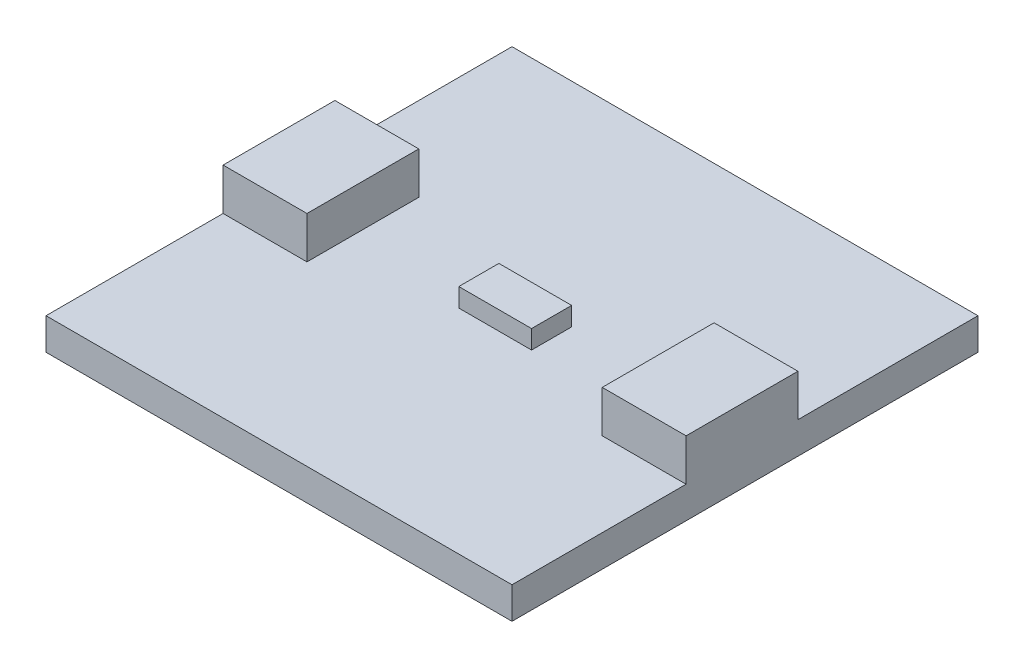
ISO-10303-21;
HEADER;
FILE_DESCRIPTION(('STEP AP214'),'2;1');
FILE_NAME('part.step','',(''),(''),'','','');
FILE_SCHEMA(('AUTOMOTIVE_DESIGN { 1 0 10303 214 1 1 1 1 }'));
ENDSEC;
DATA;
#1=APPLICATION_CONTEXT('core data for automotive mechanical design processes');
#2=APPLICATION_PROTOCOL_DEFINITION('international standard','automotive_design',2000,#1);
#3=PRODUCT_CONTEXT('',#1,'mechanical');
#4=PRODUCT('Part','Part','',(#3));
#5=PRODUCT_RELATED_PRODUCT_CATEGORY('part','',(#4));
#6=PRODUCT_DEFINITION_FORMATION('','',#4);
#7=PRODUCT_DEFINITION_CONTEXT('part definition',#1,'design');
#8=PRODUCT_DEFINITION('design','',#6,#7);
#9=PRODUCT_DEFINITION_SHAPE('','',#8);
#10=(LENGTH_UNIT() NAMED_UNIT(*) SI_UNIT(.MILLI.,.METRE.));
#11=(NAMED_UNIT(*) PLANE_ANGLE_UNIT() SI_UNIT($,.RADIAN.));
#12=(NAMED_UNIT(*) SI_UNIT($,.STERADIAN.) SOLID_ANGLE_UNIT());
#13=UNCERTAINTY_MEASURE_WITH_UNIT(LENGTH_MEASURE(1.E-05),#10,'distance_accuracy_value','');
#14=(GEOMETRIC_REPRESENTATION_CONTEXT(3) GLOBAL_UNCERTAINTY_ASSIGNED_CONTEXT((#13)) GLOBAL_UNIT_ASSIGNED_CONTEXT((#10,
#11,#12)) REPRESENTATION_CONTEXT('',''));
#15=CARTESIAN_POINT('',(0.,0.,0.));
#16=DIRECTION('',(0.,0.,1.));
#17=DIRECTION('',(1.,0.,0.));
#18=AXIS2_PLACEMENT_3D('',#15,#16,#17);
#19=CARTESIAN_POINT('',(0.,1.7272,0.));
#20=DIRECTION('',(0.,1.,0.));
#21=DIRECTION('',(0.,0.,1.));
#22=AXIS2_PLACEMENT_3D('',#19,#20,#21);
#23=PLANE('',#22);
#24=DIRECTION('',(0.,0.,-1.));
#25=VECTOR('',#24,1.);
#26=CARTESIAN_POINT('',(25.4,1.7272,0.));
#27=LINE('',#26,#25);
#28=CARTESIAN_POINT('',(25.4,1.7272,25.4));
#29=VERTEX_POINT('',#28);
#30=CARTESIAN_POINT('',(25.4,1.7272,15.9105415553491));
#31=VERTEX_POINT('',#30);
#32=EDGE_CURVE('E239',#29,#31,#27,.T.);
#33=ORIENTED_EDGE('',*,*,#32,.T.);
#34=DIRECTION('',(1.,0.,0.));
#35=VECTOR('',#34,1.);
#36=CARTESIAN_POINT('',(20.828,1.7272,15.9105415553491));
#37=LINE('',#36,#35);
#38=CARTESIAN_POINT('',(20.828,1.7272,15.9105415553491));
#39=VERTEX_POINT('',#38);
#40=EDGE_CURVE('E176',#39,#31,#37,.T.);
#41=ORIENTED_EDGE('',*,*,#40,.F.);
#42=DIRECTION('',(0.,0.,1.));
#43=VECTOR('',#42,1.);
#44=CARTESIAN_POINT('',(20.828,1.7272,9.81454155534912));
#45=LINE('',#44,#43);
#46=CARTESIAN_POINT('',(20.828,1.7272,9.81454155534912));
#47=VERTEX_POINT('',#46);
#48=EDGE_CURVE('E173',#47,#39,#45,.T.);
#49=ORIENTED_EDGE('',*,*,#48,.F.);
#50=DIRECTION('',(-1.,0.,0.));
#51=VECTOR('',#50,1.);
#52=CARTESIAN_POINT('',(20.828,1.7272,9.81454155534912));
#53=LINE('',#52,#51);
#54=CARTESIAN_POINT('',(25.4,1.7272,9.81454155534912));
#55=VERTEX_POINT('',#54);
#56=EDGE_CURVE('E185',#55,#47,#53,.T.);
#57=ORIENTED_EDGE('',*,*,#56,.F.);
#58=CARTESIAN_POINT('',(25.4,1.7272,0.));
#59=VERTEX_POINT('',#58);
#60=EDGE_CURVE('E238',#55,#59,#27,.T.);
#61=ORIENTED_EDGE('',*,*,#60,.T.);
#62=DIRECTION('',(-1.,0.,0.));
#63=VECTOR('',#62,1.);
#64=CARTESIAN_POINT('',(0.,1.7272,0.));
#65=LINE('',#64,#63);
#66=CARTESIAN_POINT('',(0.,1.7272,0.));
#67=VERTEX_POINT('',#66);
#68=EDGE_CURVE('E242',#59,#67,#65,.T.);
#69=ORIENTED_EDGE('',*,*,#68,.T.);
#70=DIRECTION('',(0.,0.,1.));
#71=VECTOR('',#70,1.);
#72=CARTESIAN_POINT('',(0.,1.7272,0.));
#73=LINE('',#72,#71);
#74=CARTESIAN_POINT('',(0.,1.7272,9.652));
#75=VERTEX_POINT('',#74);
#76=EDGE_CURVE('E233',#67,#75,#73,.T.);
#77=ORIENTED_EDGE('',*,*,#76,.T.);
#78=DIRECTION('',(-1.,0.,0.));
#79=VECTOR('',#78,1.);
#80=CARTESIAN_POINT('',(0.,1.7272,9.652));
#81=LINE('',#80,#79);
#82=CARTESIAN_POINT('',(4.572,1.7272,9.652));
#83=VERTEX_POINT('',#82);
#84=EDGE_CURVE('E207',#83,#75,#81,.T.);
#85=ORIENTED_EDGE('',*,*,#84,.F.);
#86=DIRECTION('',(0.,0.,-1.));
#87=VECTOR('',#86,1.);
#88=CARTESIAN_POINT('',(4.572,1.7272,9.652));
#89=LINE('',#88,#87);
#90=CARTESIAN_POINT('',(4.572,1.7272,15.748));
#91=VERTEX_POINT('',#90);
#92=EDGE_CURVE('E216',#91,#83,#89,.T.);
#93=ORIENTED_EDGE('',*,*,#92,.F.);
#94=DIRECTION('',(1.,0.,0.));
#95=VECTOR('',#94,1.);
#96=CARTESIAN_POINT('',(0.,1.7272,15.748));
#97=LINE('',#96,#95);
#98=CARTESIAN_POINT('',(0.,1.7272,15.748));
#99=VERTEX_POINT('',#98);
#100=EDGE_CURVE('E202',#99,#91,#97,.T.);
#101=ORIENTED_EDGE('',*,*,#100,.F.);
#102=CARTESIAN_POINT('',(0.,1.7272,25.4));
#103=VERTEX_POINT('',#102);
#104=EDGE_CURVE('E236',#99,#103,#73,.T.);
#105=ORIENTED_EDGE('',*,*,#104,.T.);
#106=DIRECTION('',(1.,0.,0.));
#107=VECTOR('',#106,1.);
#108=CARTESIAN_POINT('',(0.,1.7272,25.4));
#109=LINE('',#108,#107);
#110=EDGE_CURVE('E235',#103,#29,#109,.T.);
#111=ORIENTED_EDGE('',*,*,#110,.T.);
#112=EDGE_LOOP('',(#33,#41,#49,#57,#61,#69,#77,#85,#93,#101,#105,#111));
#113=FACE_BOUND('',#112,.T.);
#114=DIRECTION('',(1.,0.,0.));
#115=VECTOR('',#114,1.);
#116=CARTESIAN_POINT('',(10.8889001680961,1.7272,13.7885522781072));
#117=LINE('',#116,#115);
#118=CARTESIAN_POINT('',(10.8889001680961,1.7272,13.7885522781072));
#119=VERTEX_POINT('',#118);
#120=CARTESIAN_POINT('',(14.8545502203135,1.7272,13.7885522781072));
#121=VERTEX_POINT('',#120);
#122=EDGE_CURVE('E476',#119,#121,#117,.T.);
#123=ORIENTED_EDGE('',*,*,#122,.F.);
#124=DIRECTION('',(0.,0.,1.));
#125=VECTOR('',#124,1.);
#126=CARTESIAN_POINT('',(10.8889001680961,1.7272,11.6037503074584));
#127=LINE('',#126,#125);
#128=CARTESIAN_POINT('',(10.8889001680961,1.7272,11.6037503074584));
#129=VERTEX_POINT('',#128);
#130=EDGE_CURVE('E171',#129,#119,#127,.T.);
#131=ORIENTED_EDGE('',*,*,#130,.F.);
#132=DIRECTION('',(-1.,0.,0.));
#133=VECTOR('',#132,1.);
#134=CARTESIAN_POINT('',(10.8889001680961,1.7272,11.6037503074584));
#135=LINE('',#134,#133);
#136=CARTESIAN_POINT('',(14.8545502203135,1.7272,11.6037503074584));
#137=VERTEX_POINT('',#136);
#138=EDGE_CURVE('E167',#137,#129,#135,.T.);
#139=ORIENTED_EDGE('',*,*,#138,.F.);
#140=DIRECTION('',(0.,0.,-1.));
#141=VECTOR('',#140,1.);
#142=CARTESIAN_POINT('',(14.8545502203135,1.7272,11.6037503074584));
#143=LINE('',#142,#141);
#144=EDGE_CURVE('E473',#121,#137,#143,.T.);
#145=ORIENTED_EDGE('',*,*,#144,.F.);
#146=EDGE_LOOP('',(#123,#131,#139,#145));
#147=FACE_BOUND('',#146,.T.);
#148=ADVANCED_FACE('F34',(#113,#147),#23,.T.);
#149=CARTESIAN_POINT('',(0.,1.7272,0.));
#150=DIRECTION('',(1.,0.,0.));
#151=DIRECTION('',(0.,0.,-1.));
#152=AXIS2_PLACEMENT_3D('',#149,#150,#151);
#153=PLANE('',#152);
#154=DIRECTION('',(0.,0.,1.));
#155=VECTOR('',#154,1.);
#156=CARTESIAN_POINT('',(0.,0.,0.));
#157=LINE('',#156,#155);
#158=CARTESIAN_POINT('',(0.,0.,0.));
#159=VERTEX_POINT('',#158);
#160=CARTESIAN_POINT('',(0.,0.,25.4));
#161=VERTEX_POINT('',#160);
#162=EDGE_CURVE('E232',#159,#161,#157,.T.);
#163=ORIENTED_EDGE('',*,*,#162,.T.);
#164=DIRECTION('',(0.,-1.,0.));
#165=VECTOR('',#164,1.);
#166=CARTESIAN_POINT('',(0.,1.7272,25.4));
#167=LINE('',#166,#165);
#168=EDGE_CURVE('E11',#103,#161,#167,.T.);
#169=ORIENTED_EDGE('',*,*,#168,.F.);
#170=ORIENTED_EDGE('',*,*,#104,.F.);
#171=DIRECTION('',(0.,-1.,0.));
#172=VECTOR('',#171,1.);
#173=CARTESIAN_POINT('',(0.,4.0132,15.748));
#174=LINE('',#173,#172);
#175=CARTESIAN_POINT('',(0.,4.0132,15.748));
#176=VERTEX_POINT('',#175);
#177=EDGE_CURVE('E229',#176,#99,#174,.T.);
#178=ORIENTED_EDGE('',*,*,#177,.F.);
#179=DIRECTION('',(0.,0.,1.));
#180=VECTOR('',#179,1.);
#181=CARTESIAN_POINT('',(0.,4.0132,9.652));
#182=LINE('',#181,#180);
#183=CARTESIAN_POINT('',(0.,4.0132,9.652));
#184=VERTEX_POINT('',#183);
#185=EDGE_CURVE('E203',#184,#176,#182,.T.);
#186=ORIENTED_EDGE('',*,*,#185,.F.);
#187=DIRECTION('',(0.,-1.,0.));
#188=VECTOR('',#187,1.);
#189=CARTESIAN_POINT('',(0.,4.0132,9.652));
#190=LINE('',#189,#188);
#191=EDGE_CURVE('E213',#184,#75,#190,.T.);
#192=ORIENTED_EDGE('',*,*,#191,.T.);
#193=ORIENTED_EDGE('',*,*,#76,.F.);
#194=DIRECTION('',(0.,-1.,0.));
#195=VECTOR('',#194,1.);
#196=CARTESIAN_POINT('',(0.,1.7272,0.));
#197=LINE('',#196,#195);
#198=EDGE_CURVE('E244',#67,#159,#197,.T.);
#199=ORIENTED_EDGE('',*,*,#198,.T.);
#200=EDGE_LOOP('',(#163,#169,#170,#178,#186,#192,#193,#199));
#201=FACE_BOUND('',#200,.T.);
#202=ADVANCED_FACE('F36',(#201),#153,.F.);
#203=CARTESIAN_POINT('',(0.,1.7272,25.4));
#204=DIRECTION('',(0.,0.,-1.));
#205=DIRECTION('',(-1.,0.,0.));
#206=AXIS2_PLACEMENT_3D('',#203,#204,#205);
#207=PLANE('',#206);
#208=DIRECTION('',(1.,0.,0.));
#209=VECTOR('',#208,1.);
#210=CARTESIAN_POINT('',(0.,0.,25.4));
#211=LINE('',#210,#209);
#212=CARTESIAN_POINT('',(25.4,0.,25.4));
#213=VERTEX_POINT('',#212);
#214=EDGE_CURVE('E247',#161,#213,#211,.T.);
#215=ORIENTED_EDGE('',*,*,#214,.T.);
#216=DIRECTION('',(0.,-1.,0.));
#217=VECTOR('',#216,1.);
#218=CARTESIAN_POINT('',(25.4,1.7272,25.4));
#219=LINE('',#218,#217);
#220=EDGE_CURVE('E42',#29,#213,#219,.T.);
#221=ORIENTED_EDGE('',*,*,#220,.F.);
#222=ORIENTED_EDGE('',*,*,#110,.F.);
#223=ORIENTED_EDGE('',*,*,#168,.T.);
#224=EDGE_LOOP('',(#215,#221,#222,#223));
#225=FACE_BOUND('',#224,.T.);
#226=ADVANCED_FACE('F293',(#225),#207,.F.);
#227=CARTESIAN_POINT('',(25.4,1.7272,0.));
#228=DIRECTION('',(-1.,0.,0.));
#229=DIRECTION('',(0.,0.,1.));
#230=AXIS2_PLACEMENT_3D('',#227,#228,#229);
#231=PLANE('',#230);
#232=DIRECTION('',(0.,0.,-1.));
#233=VECTOR('',#232,1.);
#234=CARTESIAN_POINT('',(25.4,0.,0.));
#235=LINE('',#234,#233);
#236=CARTESIAN_POINT('',(25.4,0.,0.));
#237=VERTEX_POINT('',#236);
#238=EDGE_CURVE('E249',#213,#237,#235,.T.);
#239=ORIENTED_EDGE('',*,*,#238,.T.);
#240=DIRECTION('',(0.,-1.,0.));
#241=VECTOR('',#240,1.);
#242=CARTESIAN_POINT('',(25.4,1.7272,0.));
#243=LINE('',#242,#241);
#244=EDGE_CURVE('E255',#59,#237,#243,.T.);
#245=ORIENTED_EDGE('',*,*,#244,.F.);
#246=ORIENTED_EDGE('',*,*,#60,.F.);
#247=DIRECTION('',(0.,-1.,0.));
#248=VECTOR('',#247,1.);
#249=CARTESIAN_POINT('',(25.4,4.0132,9.81454155534912));
#250=LINE('',#249,#248);
#251=CARTESIAN_POINT('',(25.4,4.0132,9.81454155534912));
#252=VERTEX_POINT('',#251);
#253=EDGE_CURVE('E57',#252,#55,#250,.T.);
#254=ORIENTED_EDGE('',*,*,#253,.F.);
#255=DIRECTION('',(0.,0.,-1.));
#256=VECTOR('',#255,1.);
#257=CARTESIAN_POINT('',(25.4,4.0132,9.81454155534912));
#258=LINE('',#257,#256);
#259=CARTESIAN_POINT('',(25.4,4.0132,15.9105415553491));
#260=VERTEX_POINT('',#259);
#261=EDGE_CURVE('E187',#260,#252,#258,.T.);
#262=ORIENTED_EDGE('',*,*,#261,.F.);
#263=DIRECTION('',(0.,-1.,0.));
#264=VECTOR('',#263,1.);
#265=CARTESIAN_POINT('',(25.4,4.0132,15.9105415553491));
#266=LINE('',#265,#264);
#267=EDGE_CURVE('E197',#260,#31,#266,.T.);
#268=ORIENTED_EDGE('',*,*,#267,.T.);
#269=ORIENTED_EDGE('',*,*,#32,.F.);
#270=ORIENTED_EDGE('',*,*,#220,.T.);
#271=EDGE_LOOP('',(#239,#245,#246,#254,#262,#268,#269,#270));
#272=FACE_BOUND('',#271,.T.);
#273=ADVANCED_FACE('F262',(#272),#231,.F.);
#274=CARTESIAN_POINT('',(0.,1.7272,0.));
#275=DIRECTION('',(0.,0.,1.));
#276=DIRECTION('',(1.,0.,0.));
#277=AXIS2_PLACEMENT_3D('',#274,#275,#276);
#278=PLANE('',#277);
#279=DIRECTION('',(-1.,0.,0.));
#280=VECTOR('',#279,1.);
#281=CARTESIAN_POINT('',(0.,0.,0.));
#282=LINE('',#281,#280);
#283=EDGE_CURVE('E251',#237,#159,#282,.T.);
#284=ORIENTED_EDGE('',*,*,#283,.T.);
#285=ORIENTED_EDGE('',*,*,#198,.F.);
#286=ORIENTED_EDGE('',*,*,#68,.F.);
#287=ORIENTED_EDGE('',*,*,#244,.T.);
#288=EDGE_LOOP('',(#284,#285,#286,#287));
#289=FACE_BOUND('',#288,.T.);
#290=ADVANCED_FACE('F272',(#289),#278,.F.);
#291=CARTESIAN_POINT('',(0.,0.,0.));
#292=DIRECTION('',(0.,1.,0.));
#293=DIRECTION('',(0.,0.,1.));
#294=AXIS2_PLACEMENT_3D('',#291,#292,#293);
#295=PLANE('',#294);
#296=ORIENTED_EDGE('',*,*,#162,.F.);
#297=ORIENTED_EDGE('',*,*,#283,.F.);
#298=ORIENTED_EDGE('',*,*,#238,.F.);
#299=ORIENTED_EDGE('',*,*,#214,.F.);
#300=EDGE_LOOP('',(#296,#297,#298,#299));
#301=FACE_BOUND('',#300,.T.);
#302=ADVANCED_FACE('F269',(#301),#295,.F.);
#303=CARTESIAN_POINT('',(0.,4.0132,15.748));
#304=DIRECTION('',(0.,0.,-1.));
#305=DIRECTION('',(-1.,0.,0.));
#306=AXIS2_PLACEMENT_3D('',#303,#304,#305);
#307=PLANE('',#306);
#308=ORIENTED_EDGE('',*,*,#100,.T.);
#309=DIRECTION('',(0.,-1.,0.));
#310=VECTOR('',#309,1.);
#311=CARTESIAN_POINT('',(4.572,4.0132,15.748));
#312=LINE('',#311,#310);
#313=CARTESIAN_POINT('',(4.572,4.0132,15.748));
#314=VERTEX_POINT('',#313);
#315=EDGE_CURVE('E226',#314,#91,#312,.T.);
#316=ORIENTED_EDGE('',*,*,#315,.F.);
#317=DIRECTION('',(1.,0.,0.));
#318=VECTOR('',#317,1.);
#319=CARTESIAN_POINT('',(0.,4.0132,15.748));
#320=LINE('',#319,#318);
#321=EDGE_CURVE('E206',#176,#314,#320,.T.);
#322=ORIENTED_EDGE('',*,*,#321,.F.);
#323=ORIENTED_EDGE('',*,*,#177,.T.);
#324=EDGE_LOOP('',(#308,#316,#322,#323));
#325=FACE_BOUND('',#324,.T.);
#326=ADVANCED_FACE('F291',(#325),#307,.F.);
#327=CARTESIAN_POINT('',(4.572,4.0132,9.652));
#328=DIRECTION('',(-1.,0.,0.));
#329=DIRECTION('',(0.,0.,1.));
#330=AXIS2_PLACEMENT_3D('',#327,#328,#329);
#331=PLANE('',#330);
#332=ORIENTED_EDGE('',*,*,#92,.T.);
#333=DIRECTION('',(0.,-1.,0.));
#334=VECTOR('',#333,1.);
#335=CARTESIAN_POINT('',(4.572,4.0132,9.652));
#336=LINE('',#335,#334);
#337=CARTESIAN_POINT('',(4.572,4.0132,9.652));
#338=VERTEX_POINT('',#337);
#339=EDGE_CURVE('E223',#338,#83,#336,.T.);
#340=ORIENTED_EDGE('',*,*,#339,.F.);
#341=DIRECTION('',(0.,0.,-1.));
#342=VECTOR('',#341,1.);
#343=CARTESIAN_POINT('',(4.572,4.0132,9.652));
#344=LINE('',#343,#342);
#345=EDGE_CURVE('E209',#314,#338,#344,.T.);
#346=ORIENTED_EDGE('',*,*,#345,.F.);
#347=ORIENTED_EDGE('',*,*,#315,.T.);
#348=EDGE_LOOP('',(#332,#340,#346,#347));
#349=FACE_BOUND('',#348,.T.);
#350=ADVANCED_FACE('F287',(#349),#331,.F.);
#351=CARTESIAN_POINT('',(0.,4.0132,9.652));
#352=DIRECTION('',(0.,0.,1.));
#353=DIRECTION('',(1.,0.,0.));
#354=AXIS2_PLACEMENT_3D('',#351,#352,#353);
#355=PLANE('',#354);
#356=ORIENTED_EDGE('',*,*,#84,.T.);
#357=ORIENTED_EDGE('',*,*,#191,.F.);
#358=DIRECTION('',(-1.,0.,0.));
#359=VECTOR('',#358,1.);
#360=CARTESIAN_POINT('',(0.,4.0132,9.652));
#361=LINE('',#360,#359);
#362=EDGE_CURVE('E211',#338,#184,#361,.T.);
#363=ORIENTED_EDGE('',*,*,#362,.F.);
#364=ORIENTED_EDGE('',*,*,#339,.T.);
#365=EDGE_LOOP('',(#356,#357,#363,#364));
#366=FACE_BOUND('',#365,.T.);
#367=ADVANCED_FACE('F282',(#366),#355,.F.);
#368=CARTESIAN_POINT('',(0.,4.0132,0.));
#369=DIRECTION('',(0.,1.,0.));
#370=DIRECTION('',(0.,0.,1.));
#371=AXIS2_PLACEMENT_3D('',#368,#369,#370);
#372=PLANE('',#371);
#373=ORIENTED_EDGE('',*,*,#185,.T.);
#374=ORIENTED_EDGE('',*,*,#321,.T.);
#375=ORIENTED_EDGE('',*,*,#345,.T.);
#376=ORIENTED_EDGE('',*,*,#362,.T.);
#377=EDGE_LOOP('',(#373,#374,#375,#376));
#378=FACE_BOUND('',#377,.T.);
#379=ADVANCED_FACE('F338',(#378),#372,.T.);
#380=CARTESIAN_POINT('',(20.828,4.0132,9.81454155534912));
#381=DIRECTION('',(1.,0.,0.));
#382=DIRECTION('',(0.,0.,-1.));
#383=AXIS2_PLACEMENT_3D('',#380,#381,#382);
#384=PLANE('',#383);
#385=ORIENTED_EDGE('',*,*,#48,.T.);
#386=DIRECTION('',(0.,-1.,0.));
#387=VECTOR('',#386,1.);
#388=CARTESIAN_POINT('',(20.828,4.0132,15.9105415553491));
#389=LINE('',#388,#387);
#390=CARTESIAN_POINT('',(20.828,4.0132,15.9105415553491));
#391=VERTEX_POINT('',#390);
#392=EDGE_CURVE('E200',#391,#39,#389,.T.);
#393=ORIENTED_EDGE('',*,*,#392,.F.);
#394=DIRECTION('',(0.,0.,1.));
#395=VECTOR('',#394,1.);
#396=CARTESIAN_POINT('',(20.828,4.0132,9.81454155534912));
#397=LINE('',#396,#395);
#398=CARTESIAN_POINT('',(20.828,4.0132,9.81454155534912));
#399=VERTEX_POINT('',#398);
#400=EDGE_CURVE('E181',#399,#391,#397,.T.);
#401=ORIENTED_EDGE('',*,*,#400,.F.);
#402=DIRECTION('',(0.,-1.,0.));
#403=VECTOR('',#402,1.);
#404=CARTESIAN_POINT('',(20.828,4.0132,9.81454155534912));
#405=LINE('',#404,#403);
#406=EDGE_CURVE('E190',#399,#47,#405,.T.);
#407=ORIENTED_EDGE('',*,*,#406,.T.);
#408=EDGE_LOOP('',(#385,#393,#401,#407));
#409=FACE_BOUND('',#408,.T.);
#410=ADVANCED_FACE('F346',(#409),#384,.F.);
#411=CARTESIAN_POINT('',(20.828,4.0132,15.9105415553491));
#412=DIRECTION('',(0.,0.,-1.));
#413=DIRECTION('',(-1.,0.,0.));
#414=AXIS2_PLACEMENT_3D('',#411,#412,#413);
#415=PLANE('',#414);
#416=ORIENTED_EDGE('',*,*,#40,.T.);
#417=ORIENTED_EDGE('',*,*,#267,.F.);
#418=DIRECTION('',(1.,0.,0.));
#419=VECTOR('',#418,1.);
#420=CARTESIAN_POINT('',(20.828,4.0132,15.9105415553491));
#421=LINE('',#420,#419);
#422=EDGE_CURVE('E184',#391,#260,#421,.T.);
#423=ORIENTED_EDGE('',*,*,#422,.F.);
#424=ORIENTED_EDGE('',*,*,#392,.T.);
#425=EDGE_LOOP('',(#416,#417,#423,#424));
#426=FACE_BOUND('',#425,.T.);
#427=ADVANCED_FACE('F353',(#426),#415,.F.);
#428=CARTESIAN_POINT('',(20.828,4.0132,9.81454155534912));
#429=DIRECTION('',(0.,0.,1.));
#430=DIRECTION('',(1.,0.,0.));
#431=AXIS2_PLACEMENT_3D('',#428,#429,#430);
#432=PLANE('',#431);
#433=ORIENTED_EDGE('',*,*,#56,.T.);
#434=ORIENTED_EDGE('',*,*,#406,.F.);
#435=DIRECTION('',(-1.,0.,0.));
#436=VECTOR('',#435,1.);
#437=CARTESIAN_POINT('',(20.828,4.0132,9.81454155534912));
#438=LINE('',#437,#436);
#439=EDGE_CURVE('E189',#252,#399,#438,.T.);
#440=ORIENTED_EDGE('',*,*,#439,.F.);
#441=ORIENTED_EDGE('',*,*,#253,.T.);
#442=EDGE_LOOP('',(#433,#434,#440,#441));
#443=FACE_BOUND('',#442,.T.);
#444=ADVANCED_FACE('F361',(#443),#432,.F.);
#445=CARTESIAN_POINT('',(0.,4.0132,0.));
#446=DIRECTION('',(0.,1.,0.));
#447=DIRECTION('',(0.,0.,1.));
#448=AXIS2_PLACEMENT_3D('',#445,#446,#447);
#449=PLANE('',#448);
#450=ORIENTED_EDGE('',*,*,#400,.T.);
#451=ORIENTED_EDGE('',*,*,#422,.T.);
#452=ORIENTED_EDGE('',*,*,#261,.T.);
#453=ORIENTED_EDGE('',*,*,#439,.T.);
#454=EDGE_LOOP('',(#450,#451,#452,#453));
#455=FACE_BOUND('',#454,.T.);
#456=ADVANCED_FACE('F369',(#455),#449,.T.);
#457=CARTESIAN_POINT('',(10.8889001680961,2.7432,11.6037503074584));
#458=DIRECTION('',(1.,0.,0.));
#459=DIRECTION('',(0.,0.,-1.));
#460=AXIS2_PLACEMENT_3D('',#457,#458,#459);
#461=PLANE('',#460);
#462=ORIENTED_EDGE('',*,*,#130,.T.);
#463=DIRECTION('',(0.,-1.,0.));
#464=VECTOR('',#463,1.);
#465=CARTESIAN_POINT('',(10.8889001680961,2.7432,13.7885522781072));
#466=LINE('',#465,#464);
#467=CARTESIAN_POINT('',(10.8889001680961,2.7432,13.7885522781072));
#468=VERTEX_POINT('',#467);
#469=EDGE_CURVE('E152',#468,#119,#466,.T.);
#470=ORIENTED_EDGE('',*,*,#469,.F.);
#471=DIRECTION('',(0.,0.,1.));
#472=VECTOR('',#471,1.);
#473=CARTESIAN_POINT('',(10.8889001680961,2.7432,11.6037503074584));
#474=LINE('',#473,#472);
#475=CARTESIAN_POINT('',(10.8889001680961,2.7432,11.6037503074584));
#476=VERTEX_POINT('',#475);
#477=EDGE_CURVE('E159',#476,#468,#474,.T.);
#478=ORIENTED_EDGE('',*,*,#477,.F.);
#479=DIRECTION('',(0.,-1.,0.));
#480=VECTOR('',#479,1.);
#481=CARTESIAN_POINT('',(10.8889001680961,2.7432,11.6037503074584));
#482=LINE('',#481,#480);
#483=EDGE_CURVE('E471',#476,#129,#482,.T.);
#484=ORIENTED_EDGE('',*,*,#483,.T.);
#485=EDGE_LOOP('',(#462,#470,#478,#484));
#486=FACE_BOUND('',#485,.T.);
#487=ADVANCED_FACE('F169',(#486),#461,.F.);
#488=CARTESIAN_POINT('',(10.8889001680961,2.7432,13.7885522781072));
#489=DIRECTION('',(0.,0.,-1.));
#490=DIRECTION('',(-1.,0.,0.));
#491=AXIS2_PLACEMENT_3D('',#488,#489,#490);
#492=PLANE('',#491);
#493=ORIENTED_EDGE('',*,*,#122,.T.);
#494=DIRECTION('',(0.,-1.,0.));
#495=VECTOR('',#494,1.);
#496=CARTESIAN_POINT('',(14.8545502203135,2.7432,13.7885522781072));
#497=LINE('',#496,#495);
#498=CARTESIAN_POINT('',(14.8545502203135,2.7432,13.7885522781072));
#499=VERTEX_POINT('',#498);
#500=EDGE_CURVE('E155',#499,#121,#497,.T.);
#501=ORIENTED_EDGE('',*,*,#500,.F.);
#502=DIRECTION('',(1.,0.,0.));
#503=VECTOR('',#502,1.);
#504=CARTESIAN_POINT('',(10.8889001680961,2.7432,13.7885522781072));
#505=LINE('',#504,#503);
#506=EDGE_CURVE('E148',#468,#499,#505,.T.);
#507=ORIENTED_EDGE('',*,*,#506,.F.);
#508=ORIENTED_EDGE('',*,*,#469,.T.);
#509=EDGE_LOOP('',(#493,#501,#507,#508));
#510=FACE_BOUND('',#509,.T.);
#511=ADVANCED_FACE('F150',(#510),#492,.F.);
#512=CARTESIAN_POINT('',(14.8545502203135,2.7432,11.6037503074584));
#513=DIRECTION('',(-1.,0.,0.));
#514=DIRECTION('',(0.,0.,1.));
#515=AXIS2_PLACEMENT_3D('',#512,#513,#514);
#516=PLANE('',#515);
#517=ORIENTED_EDGE('',*,*,#144,.T.);
#518=DIRECTION('',(0.,-1.,0.));
#519=VECTOR('',#518,1.);
#520=CARTESIAN_POINT('',(14.8545502203135,2.7432,11.6037503074584));
#521=LINE('',#520,#519);
#522=CARTESIAN_POINT('',(14.8545502203135,2.7432,11.6037503074584));
#523=VERTEX_POINT('',#522);
#524=EDGE_CURVE('E49',#523,#137,#521,.T.);
#525=ORIENTED_EDGE('',*,*,#524,.F.);
#526=DIRECTION('',(0.,0.,-1.));
#527=VECTOR('',#526,1.);
#528=CARTESIAN_POINT('',(14.8545502203135,2.7432,11.6037503074584));
#529=LINE('',#528,#527);
#530=EDGE_CURVE('E158',#499,#523,#529,.T.);
#531=ORIENTED_EDGE('',*,*,#530,.F.);
#532=ORIENTED_EDGE('',*,*,#500,.T.);
#533=EDGE_LOOP('',(#517,#525,#531,#532));
#534=FACE_BOUND('',#533,.T.);
#535=ADVANCED_FACE('F389',(#534),#516,.F.);
#536=CARTESIAN_POINT('',(10.8889001680961,2.7432,11.6037503074584));
#537=DIRECTION('',(0.,0.,1.));
#538=DIRECTION('',(1.,0.,0.));
#539=AXIS2_PLACEMENT_3D('',#536,#537,#538);
#540=PLANE('',#539);
#541=ORIENTED_EDGE('',*,*,#138,.T.);
#542=ORIENTED_EDGE('',*,*,#483,.F.);
#543=DIRECTION('',(-1.,0.,0.));
#544=VECTOR('',#543,1.);
#545=CARTESIAN_POINT('',(10.8889001680961,2.7432,11.6037503074584));
#546=LINE('',#545,#544);
#547=EDGE_CURVE('E163',#523,#476,#546,.T.);
#548=ORIENTED_EDGE('',*,*,#547,.F.);
#549=ORIENTED_EDGE('',*,*,#524,.T.);
#550=EDGE_LOOP('',(#541,#542,#548,#549));
#551=FACE_BOUND('',#550,.T.);
#552=ADVANCED_FACE('F396',(#551),#540,.F.);
#553=CARTESIAN_POINT('',(0.,2.7432,0.));
#554=DIRECTION('',(0.,1.,0.));
#555=DIRECTION('',(0.,0.,1.));
#556=AXIS2_PLACEMENT_3D('',#553,#554,#555);
#557=PLANE('',#556);
#558=ORIENTED_EDGE('',*,*,#477,.T.);
#559=ORIENTED_EDGE('',*,*,#506,.T.);
#560=ORIENTED_EDGE('',*,*,#530,.T.);
#561=ORIENTED_EDGE('',*,*,#547,.T.);
#562=EDGE_LOOP('',(#558,#559,#560,#561));
#563=FACE_BOUND('',#562,.T.);
#564=ADVANCED_FACE('F162',(#563),#557,.T.);
#565=CLOSED_SHELL('',(#148,#202,#226,#273,#290,#302,#326,#350,#367,#379,#410,#427,#444,#456,
#487,#511,#535,#552,#564));
#566=MANIFOLD_SOLID_BREP('B2',#565);
#567=ADVANCED_BREP_SHAPE_REPRESENTATION('',(#18,#566),#14);
#568=SHAPE_DEFINITION_REPRESENTATION(#9,#567);
ENDSEC;
END-ISO-10303-21;
